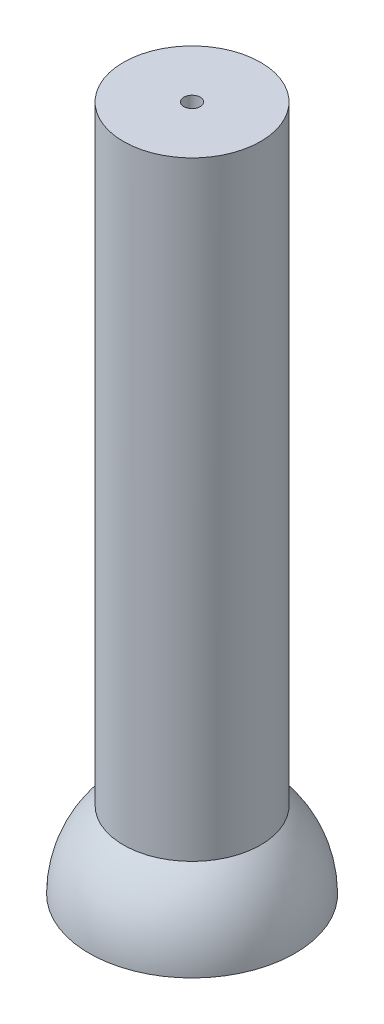
ISO-10303-21;
HEADER;
FILE_DESCRIPTION(('STEP AP214'),'2;1');
FILE_NAME('part.step','',(''),(''),'','','');
FILE_SCHEMA(('AUTOMOTIVE_DESIGN { 1 0 10303 214 1 1 1 1 }'));
ENDSEC;
DATA;
#1=APPLICATION_CONTEXT('core data for automotive mechanical design processes');
#2=APPLICATION_PROTOCOL_DEFINITION('international standard','automotive_design',2000,#1);
#3=PRODUCT_CONTEXT('',#1,'mechanical');
#4=PRODUCT('Part','Part','',(#3));
#5=PRODUCT_RELATED_PRODUCT_CATEGORY('part','',(#4));
#6=PRODUCT_DEFINITION_FORMATION('','',#4);
#7=PRODUCT_DEFINITION_CONTEXT('part definition',#1,'design');
#8=PRODUCT_DEFINITION('design','',#6,#7);
#9=PRODUCT_DEFINITION_SHAPE('','',#8);
#10=(LENGTH_UNIT() NAMED_UNIT(*) SI_UNIT(.MILLI.,.METRE.));
#11=(NAMED_UNIT(*) PLANE_ANGLE_UNIT() SI_UNIT($,.RADIAN.));
#12=(NAMED_UNIT(*) SI_UNIT($,.STERADIAN.) SOLID_ANGLE_UNIT());
#13=UNCERTAINTY_MEASURE_WITH_UNIT(LENGTH_MEASURE(1.E-05),#10,'distance_accuracy_value','');
#14=(GEOMETRIC_REPRESENTATION_CONTEXT(3) GLOBAL_UNCERTAINTY_ASSIGNED_CONTEXT((#13)) GLOBAL_UNIT_ASSIGNED_CONTEXT((#10,
#11,#12)) REPRESENTATION_CONTEXT('',''));
#15=CARTESIAN_POINT('',(0.,0.,0.));
#16=DIRECTION('',(0.,0.,1.));
#17=DIRECTION('',(1.,0.,0.));
#18=AXIS2_PLACEMENT_3D('',#15,#16,#17);
#19=CARTESIAN_POINT('',(0.,0.,0.));
#20=DIRECTION('',(1.,0.,0.));
#21=DIRECTION('',(0.,0.,-1.));
#22=AXIS2_PLACEMENT_3D('',#19,#20,#21);
#23=SPHERICAL_SURFACE('',#22,7.5);
#24=CARTESIAN_POINT('',(0.,0.,0.));
#25=DIRECTION('',(0.,-1.,0.));
#26=DIRECTION('',(0.,0.,-1.));
#27=AXIS2_PLACEMENT_3D('',#24,#25,#26);
#28=SPHERICAL_SURFACE('',#27,7.5);
#29=CARTESIAN_POINT('',(0.,0.,0.));
#30=DIRECTION('',(0.,-1.,0.));
#31=DIRECTION('',(0.,0.,-1.));
#32=AXIS2_PLACEMENT_3D('',#29,#30,#31);
#33=CIRCLE('',#32,7.5);
#34=CARTESIAN_POINT('',(0.,0.,-7.5));
#35=VERTEX_POINT('',#34);
#36=EDGE_CURVE('E34',#35,#35,#33,.T.);
#37=ORIENTED_EDGE('',*,*,#36,.F.);
#38=EDGE_LOOP('',(#37));
#39=FACE_BOUND('',#38,.T.);
#40=CARTESIAN_POINT('',(0.,5.59016994374947,0.));
#41=DIRECTION('',(0.,-1.,0.));
#42=DIRECTION('',(0.,0.,-1.));
#43=AXIS2_PLACEMENT_3D('',#40,#41,#42);
#44=CIRCLE('',#43,5.);
#45=CARTESIAN_POINT('',(0.,5.59016994374947,-5.));
#46=VERTEX_POINT('',#45);
#47=EDGE_CURVE('E10',#46,#46,#44,.F.);
#48=ORIENTED_EDGE('',*,*,#47,.F.);
#49=EDGE_LOOP('',(#48));
#50=FACE_BOUND('',#49,.T.);
#51=ADVANCED_FACE('F31',(#39,#50),#28,.T.);
#52=CARTESIAN_POINT('',(0.,0.,0.));
#53=DIRECTION('',(0.,-1.,0.));
#54=DIRECTION('',(0.,0.,-1.));
#55=AXIS2_PLACEMENT_3D('',#52,#53,#54);
#56=PLANE('',#55);
#57=CARTESIAN_POINT('',(0.,0.,0.));
#58=DIRECTION('',(0.,-1.,0.));
#59=DIRECTION('',(0.,0.,-1.));
#60=AXIS2_PLACEMENT_3D('',#57,#58,#59);
#61=CIRCLE('',#60,0.895);
#62=CARTESIAN_POINT('',(0.,0.,-0.895));
#63=VERTEX_POINT('',#62);
#64=EDGE_CURVE('E52',#63,#63,#61,.T.);
#65=ORIENTED_EDGE('',*,*,#64,.F.);
#66=EDGE_LOOP('',(#65));
#67=FACE_BOUND('',#66,.T.);
#68=ORIENTED_EDGE('',*,*,#36,.T.);
#69=EDGE_LOOP('',(#68));
#70=FACE_BOUND('',#69,.T.);
#71=ADVANCED_FACE('F67',(#67,#70),#56,.T.);
#72=CARTESIAN_POINT('',(0.,50.,0.));
#73=DIRECTION('',(0.,-1.,0.));
#74=DIRECTION('',(0.,0.,-1.));
#75=AXIS2_PLACEMENT_3D('',#72,#73,#74);
#76=CYLINDRICAL_SURFACE('',#75,5.);
#77=CARTESIAN_POINT('',(0.,50.,0.));
#78=DIRECTION('',(0.,1.,0.));
#79=DIRECTION('',(0.,0.,1.));
#80=AXIS2_PLACEMENT_3D('',#77,#78,#79);
#81=CIRCLE('',#80,5.);
#82=CARTESIAN_POINT('',(0.,50.,5.));
#83=VERTEX_POINT('',#82);
#84=EDGE_CURVE('E41',#83,#83,#81,.T.);
#85=ORIENTED_EDGE('',*,*,#84,.F.);
#86=EDGE_LOOP('',(#85));
#87=FACE_BOUND('',#86,.T.);
#88=ORIENTED_EDGE('',*,*,#47,.T.);
#89=EDGE_LOOP('',(#88));
#90=FACE_BOUND('',#89,.T.);
#91=ADVANCED_FACE('F70',(#87,#90),#76,.T.);
#92=CARTESIAN_POINT('',(0.,50.,0.));
#93=DIRECTION('',(0.,1.,0.));
#94=DIRECTION('',(0.,0.,1.));
#95=AXIS2_PLACEMENT_3D('',#92,#93,#94);
#96=PLANE('',#95);
#97=CARTESIAN_POINT('',(0.,50.,0.));
#98=DIRECTION('',(0.,1.,0.));
#99=DIRECTION('',(0.,0.,1.));
#100=AXIS2_PLACEMENT_3D('',#97,#98,#99);
#101=CIRCLE('',#100,0.6);
#102=CARTESIAN_POINT('',(0.,50.,0.6));
#103=VERTEX_POINT('',#102);
#104=EDGE_CURVE('E46',#103,#103,#101,.T.);
#105=ORIENTED_EDGE('',*,*,#104,.F.);
#106=EDGE_LOOP('',(#105));
#107=FACE_BOUND('',#106,.T.);
#108=ORIENTED_EDGE('',*,*,#84,.T.);
#109=EDGE_LOOP('',(#108));
#110=FACE_BOUND('',#109,.T.);
#111=ADVANCED_FACE('F89',(#107,#110),#96,.T.);
#112=CARTESIAN_POINT('',(0.,45.,0.));
#113=DIRECTION('',(0.,1.,0.));
#114=DIRECTION('',(0.,0.,1.));
#115=AXIS2_PLACEMENT_3D('',#112,#113,#114);
#116=CYLINDRICAL_SURFACE('',#115,0.6);
#117=CARTESIAN_POINT('',(0.,45.,0.));
#118=DIRECTION('',(0.,1.,0.));
#119=DIRECTION('',(0.,0.,1.));
#120=AXIS2_PLACEMENT_3D('',#117,#118,#119);
#121=CIRCLE('',#120,0.6);
#122=CARTESIAN_POINT('',(0.,45.,0.6));
#123=VERTEX_POINT('',#122);
#124=EDGE_CURVE('E45',#123,#123,#121,.T.);
#125=ORIENTED_EDGE('',*,*,#124,.F.);
#126=EDGE_LOOP('',(#125));
#127=FACE_BOUND('',#126,.T.);
#128=ORIENTED_EDGE('',*,*,#104,.T.);
#129=EDGE_LOOP('',(#128));
#130=FACE_BOUND('',#129,.T.);
#131=ADVANCED_FACE('F97',(#127,#130),#116,.F.);
#132=CARTESIAN_POINT('',(0.,45.,0.));
#133=DIRECTION('',(0.,1.,0.));
#134=DIRECTION('',(0.,0.,1.));
#135=AXIS2_PLACEMENT_3D('',#132,#133,#134);
#136=PLANE('',#135);
#137=ORIENTED_EDGE('',*,*,#124,.T.);
#138=EDGE_LOOP('',(#137));
#139=FACE_BOUND('',#138,.T.);
#140=ADVANCED_FACE('F63',(#139),#136,.T.);
#141=CARTESIAN_POINT('',(0.,33.,-2.30437768363647E-13));
#142=DIRECTION('',(0.,-1.,0.));
#143=DIRECTION('',(0.,0.,-1.));
#144=AXIS2_PLACEMENT_3D('',#141,#142,#143);
#145=CYLINDRICAL_SURFACE('',#144,0.895);
#146=CARTESIAN_POINT('',(0.,33.,-2.30437768363647E-13));
#147=DIRECTION('',(0.,-1.,0.));
#148=DIRECTION('',(0.,0.,-1.));
#149=AXIS2_PLACEMENT_3D('',#146,#147,#148);
#150=CIRCLE('',#149,0.895);
#151=CARTESIAN_POINT('',(0.,33.,-0.895000000000231));
#152=VERTEX_POINT('',#151);
#153=EDGE_CURVE('E49',#152,#152,#150,.T.);
#154=ORIENTED_EDGE('',*,*,#153,.F.);
#155=EDGE_LOOP('',(#154));
#156=FACE_BOUND('',#155,.T.);
#157=ORIENTED_EDGE('',*,*,#64,.T.);
#158=EDGE_LOOP('',(#157));
#159=FACE_BOUND('',#158,.T.);
#160=ADVANCED_FACE('F60',(#156,#159),#145,.F.);
#161=CARTESIAN_POINT('',(0.,33.,-2.30437768363647E-13));
#162=DIRECTION('',(0.,-1.,0.));
#163=DIRECTION('',(0.,0.,-1.));
#164=AXIS2_PLACEMENT_3D('',#161,#162,#163);
#165=PLANE('',#164);
#166=ORIENTED_EDGE('',*,*,#153,.T.);
#167=EDGE_LOOP('',(#166));
#168=FACE_BOUND('',#167,.T.);
#169=ADVANCED_FACE('F58',(#168),#165,.T.);
#170=CLOSED_SHELL('',(#51,#71,#91,#111,#131,#140,#160,#169));
#171=MANIFOLD_SOLID_BREP('B2',#170);
#172=ADVANCED_BREP_SHAPE_REPRESENTATION('',(#18,#171),#14);
#173=SHAPE_DEFINITION_REPRESENTATION(#9,#172);
ENDSEC;
END-ISO-10303-21;
